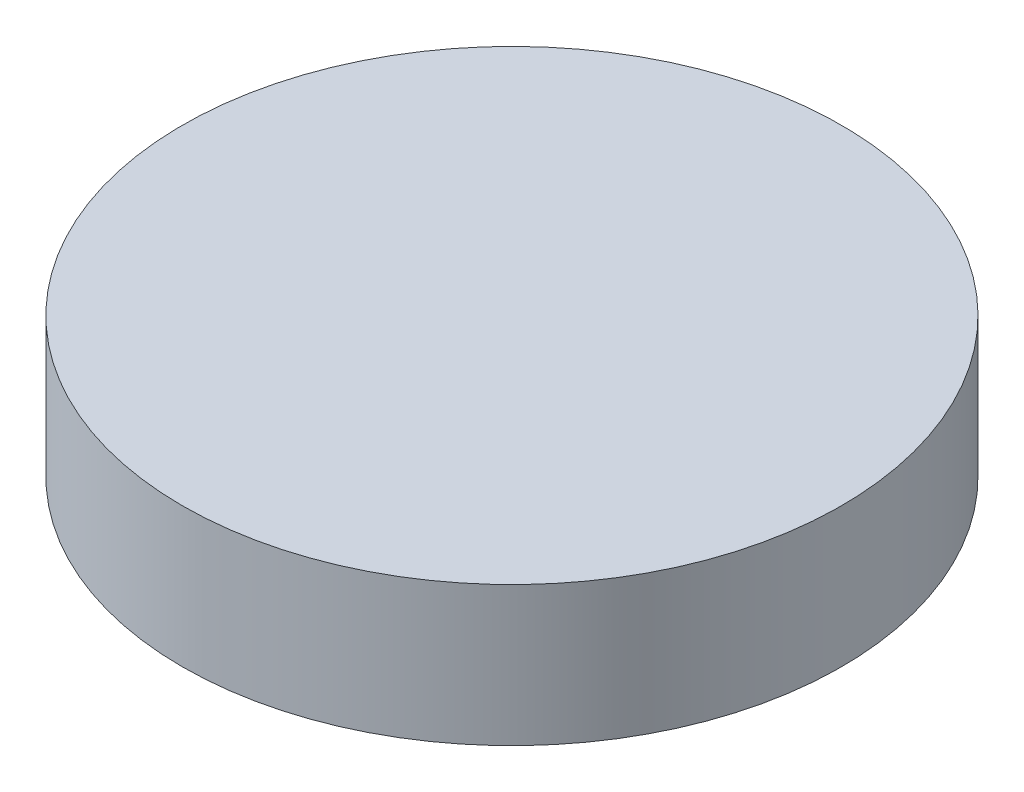
ISO-10303-21;
HEADER;
FILE_DESCRIPTION(('STEP AP214'),'2;1');
FILE_NAME('part.step','',(''),(''),'','','');
FILE_SCHEMA(('AUTOMOTIVE_DESIGN { 1 0 10303 214 1 1 1 1 }'));
ENDSEC;
DATA;
#1=APPLICATION_CONTEXT('core data for automotive mechanical design processes');
#2=APPLICATION_PROTOCOL_DEFINITION('international standard','automotive_design',2000,#1);
#3=PRODUCT_CONTEXT('',#1,'mechanical');
#4=PRODUCT('Part','Part','',(#3));
#5=PRODUCT_RELATED_PRODUCT_CATEGORY('part','',(#4));
#6=PRODUCT_DEFINITION_FORMATION('','',#4);
#7=PRODUCT_DEFINITION_CONTEXT('part definition',#1,'design');
#8=PRODUCT_DEFINITION('design','',#6,#7);
#9=PRODUCT_DEFINITION_SHAPE('','',#8);
#10=(LENGTH_UNIT() NAMED_UNIT(*) SI_UNIT(.MILLI.,.METRE.));
#11=(NAMED_UNIT(*) PLANE_ANGLE_UNIT() SI_UNIT($,.RADIAN.));
#12=(NAMED_UNIT(*) SI_UNIT($,.STERADIAN.) SOLID_ANGLE_UNIT());
#13=UNCERTAINTY_MEASURE_WITH_UNIT(LENGTH_MEASURE(1.E-05),#10,'distance_accuracy_value','');
#14=(GEOMETRIC_REPRESENTATION_CONTEXT(3) GLOBAL_UNCERTAINTY_ASSIGNED_CONTEXT((#13)) GLOBAL_UNIT_ASSIGNED_CONTEXT((#10,
#11,#12)) REPRESENTATION_CONTEXT('',''));
#15=CARTESIAN_POINT('',(0.,0.,0.));
#16=DIRECTION('',(0.,0.,1.));
#17=DIRECTION('',(1.,0.,0.));
#18=AXIS2_PLACEMENT_3D('',#15,#16,#17);
#19=CARTESIAN_POINT('',(0.,6.35,0.));
#20=DIRECTION('',(0.,-1.,0.));
#21=DIRECTION('',(0.,0.,-1.));
#22=AXIS2_PLACEMENT_3D('',#19,#20,#21);
#23=CYLINDRICAL_SURFACE('',#22,15.);
#24=CARTESIAN_POINT('',(0.,6.35,0.));
#25=DIRECTION('',(0.,1.,0.));
#26=DIRECTION('',(0.,0.,1.));
#27=AXIS2_PLACEMENT_3D('',#24,#25,#26);
#28=CIRCLE('',#27,15.);
#29=CARTESIAN_POINT('',(0.,6.35,15.));
#30=VERTEX_POINT('',#29);
#31=EDGE_CURVE('E10',#30,#30,#28,.T.);
#32=ORIENTED_EDGE('',*,*,#31,.F.);
#33=EDGE_LOOP('',(#32));
#34=FACE_BOUND('',#33,.T.);
#35=CARTESIAN_POINT('',(0.,0.,0.));
#36=DIRECTION('',(0.,1.,0.));
#37=DIRECTION('',(0.,0.,1.));
#38=AXIS2_PLACEMENT_3D('',#35,#36,#37);
#39=CIRCLE('',#38,15.);
#40=CARTESIAN_POINT('',(0.,0.,15.));
#41=VERTEX_POINT('',#40);
#42=EDGE_CURVE('E40',#41,#41,#39,.T.);
#43=ORIENTED_EDGE('',*,*,#42,.T.);
#44=EDGE_LOOP('',(#43));
#45=FACE_BOUND('',#44,.T.);
#46=ADVANCED_FACE('F37',(#34,#45),#23,.T.);
#47=CARTESIAN_POINT('',(0.,6.35,0.));
#48=DIRECTION('',(0.,1.,0.));
#49=DIRECTION('',(0.,0.,1.));
#50=AXIS2_PLACEMENT_3D('',#47,#48,#49);
#51=PLANE('',#50);
#52=ORIENTED_EDGE('',*,*,#31,.T.);
#53=EDGE_LOOP('',(#52));
#54=FACE_BOUND('',#53,.T.);
#55=ADVANCED_FACE('F54',(#54),#51,.T.);
#56=CARTESIAN_POINT('',(0.,0.,0.));
#57=DIRECTION('',(0.,1.,0.));
#58=DIRECTION('',(0.,0.,1.));
#59=AXIS2_PLACEMENT_3D('',#56,#57,#58);
#60=PLANE('',#59);
#61=ORIENTED_EDGE('',*,*,#42,.F.);
#62=EDGE_LOOP('',(#61));
#63=FACE_BOUND('',#62,.T.);
#64=ADVANCED_FACE('F52',(#63),#60,.F.);
#65=CLOSED_SHELL('',(#46,#55,#64));
#66=MANIFOLD_SOLID_BREP('B2',#65);
#67=ADVANCED_BREP_SHAPE_REPRESENTATION('',(#18,#66),#14);
#68=SHAPE_DEFINITION_REPRESENTATION(#9,#67);
ENDSEC;
END-ISO-10303-21;
